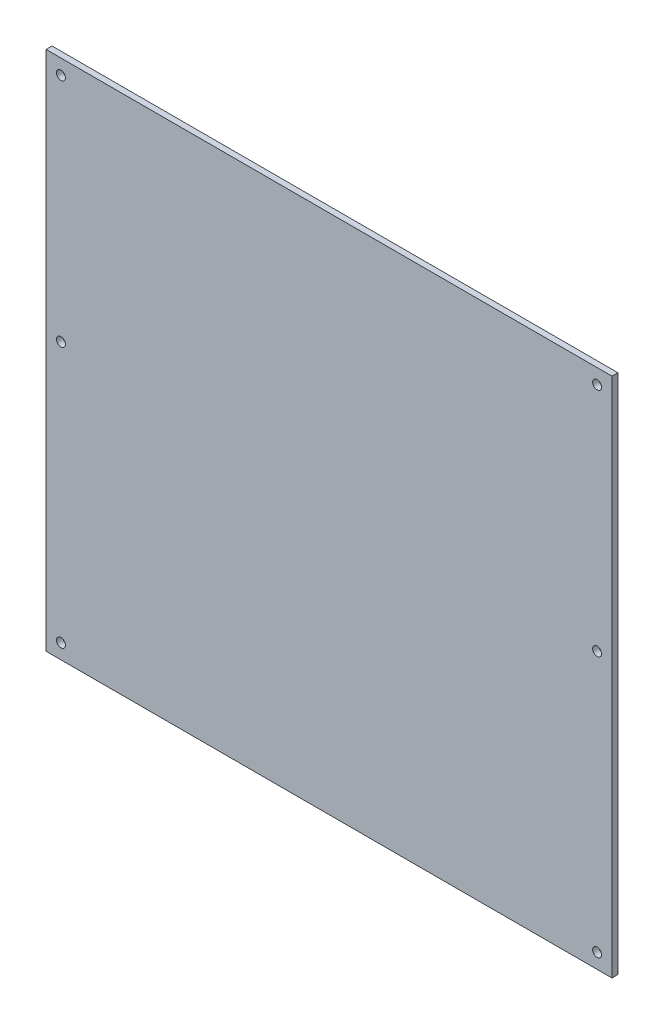
ISO-10303-21;
HEADER;
FILE_DESCRIPTION(('STEP AP214'),'2;1');
FILE_NAME('part.step','',(''),(''),'','','');
FILE_SCHEMA(('AUTOMOTIVE_DESIGN { 1 0 10303 214 1 1 1 1 }'));
ENDSEC;
DATA;
#1=APPLICATION_CONTEXT('core data for automotive mechanical design processes');
#2=APPLICATION_PROTOCOL_DEFINITION('international standard','automotive_design',2000,#1);
#3=PRODUCT_CONTEXT('',#1,'mechanical');
#4=PRODUCT('Part','Part','',(#3));
#5=PRODUCT_RELATED_PRODUCT_CATEGORY('part','',(#4));
#6=PRODUCT_DEFINITION_FORMATION('','',#4);
#7=PRODUCT_DEFINITION_CONTEXT('part definition',#1,'design');
#8=PRODUCT_DEFINITION('design','',#6,#7);
#9=PRODUCT_DEFINITION_SHAPE('','',#8);
#10=(LENGTH_UNIT() NAMED_UNIT(*) SI_UNIT(.MILLI.,.METRE.));
#11=(NAMED_UNIT(*) PLANE_ANGLE_UNIT() SI_UNIT($,.RADIAN.));
#12=(NAMED_UNIT(*) SI_UNIT($,.STERADIAN.) SOLID_ANGLE_UNIT());
#13=UNCERTAINTY_MEASURE_WITH_UNIT(LENGTH_MEASURE(1.E-05),#10,'distance_accuracy_value','');
#14=(GEOMETRIC_REPRESENTATION_CONTEXT(3) GLOBAL_UNCERTAINTY_ASSIGNED_CONTEXT((#13)) GLOBAL_UNIT_ASSIGNED_CONTEXT((#10,
#11,#12)) REPRESENTATION_CONTEXT('',''));
#15=CARTESIAN_POINT('',(0.,0.,0.));
#16=DIRECTION('',(0.,0.,1.));
#17=DIRECTION('',(1.,0.,0.));
#18=AXIS2_PLACEMENT_3D('',#15,#16,#17);
#19=CARTESIAN_POINT('',(0.,0.,4.));
#20=DIRECTION('',(0.,0.,1.));
#21=DIRECTION('',(1.,0.,0.));
#22=AXIS2_PLACEMENT_3D('',#19,#20,#21);
#23=PLANE('',#22);
#24=CARTESIAN_POINT('',(-180.,9.99999999999998,4.));
#25=DIRECTION('',(0.,0.,1.));
#26=DIRECTION('',(1.,0.,0.));
#27=AXIS2_PLACEMENT_3D('',#24,#25,#26);
#28=CIRCLE('',#27,2.99999999999999);
#29=CARTESIAN_POINT('',(-177.,9.99999999999998,4.));
#30=VERTEX_POINT('',#29);
#31=EDGE_CURVE('E133',#30,#30,#28,.T.);
#32=ORIENTED_EDGE('',*,*,#31,.F.);
#33=EDGE_LOOP('',(#32));
#34=FACE_BOUND('',#33,.T.);
#35=CARTESIAN_POINT('',(180.,9.99999999999998,4.));
#36=DIRECTION('',(0.,0.,1.));
#37=DIRECTION('',(1.,0.,0.));
#38=AXIS2_PLACEMENT_3D('',#35,#36,#37);
#39=CIRCLE('',#38,2.99999999999999);
#40=CARTESIAN_POINT('',(183.,9.99999999999998,4.));
#41=VERTEX_POINT('',#40);
#42=EDGE_CURVE('E121',#41,#41,#39,.T.);
#43=ORIENTED_EDGE('',*,*,#42,.F.);
#44=EDGE_LOOP('',(#43));
#45=FACE_BOUND('',#44,.T.);
#46=CARTESIAN_POINT('',(-180.,165.,4.));
#47=DIRECTION('',(0.,0.,1.));
#48=DIRECTION('',(1.,0.,0.));
#49=AXIS2_PLACEMENT_3D('',#46,#47,#48);
#50=CIRCLE('',#49,2.99999999999999);
#51=CARTESIAN_POINT('',(-177.,165.,4.));
#52=VERTEX_POINT('',#51);
#53=EDGE_CURVE('E100',#52,#52,#50,.T.);
#54=ORIENTED_EDGE('',*,*,#53,.F.);
#55=EDGE_LOOP('',(#54));
#56=FACE_BOUND('',#55,.T.);
#57=DIRECTION('',(0.,-1.,0.));
#58=VECTOR('',#57,1.);
#59=CARTESIAN_POINT('',(-190.,-175.,4.));
#60=LINE('',#59,#58);
#61=CARTESIAN_POINT('',(-190.,175.,4.));
#62=VERTEX_POINT('',#61);
#63=CARTESIAN_POINT('',(-190.,-175.,4.));
#64=VERTEX_POINT('',#63);
#65=EDGE_CURVE('E85',#62,#64,#60,.T.);
#66=ORIENTED_EDGE('',*,*,#65,.T.);
#67=DIRECTION('',(1.,0.,0.));
#68=VECTOR('',#67,1.);
#69=CARTESIAN_POINT('',(190.,-175.,4.));
#70=LINE('',#69,#68);
#71=CARTESIAN_POINT('',(190.,-175.,4.));
#72=VERTEX_POINT('',#71);
#73=EDGE_CURVE('E80',#64,#72,#70,.T.);
#74=ORIENTED_EDGE('',*,*,#73,.T.);
#75=DIRECTION('',(0.,1.,0.));
#76=VECTOR('',#75,1.);
#77=CARTESIAN_POINT('',(190.,-175.,4.));
#78=LINE('',#77,#76);
#79=CARTESIAN_POINT('',(190.,175.,4.));
#80=VERTEX_POINT('',#79);
#81=EDGE_CURVE('E83',#72,#80,#78,.T.);
#82=ORIENTED_EDGE('',*,*,#81,.T.);
#83=DIRECTION('',(-1.,0.,0.));
#84=VECTOR('',#83,1.);
#85=CARTESIAN_POINT('',(190.,175.,4.));
#86=LINE('',#85,#84);
#87=EDGE_CURVE('E50',#80,#62,#86,.T.);
#88=ORIENTED_EDGE('',*,*,#87,.T.);
#89=EDGE_LOOP('',(#66,#74,#82,#88));
#90=FACE_BOUND('',#89,.T.);
#91=CARTESIAN_POINT('',(180.,165.,4.));
#92=DIRECTION('',(0.,0.,1.));
#93=DIRECTION('',(1.,0.,0.));
#94=AXIS2_PLACEMENT_3D('',#91,#92,#93);
#95=CIRCLE('',#94,2.99999999999999);
#96=CARTESIAN_POINT('',(183.,165.,4.));
#97=VERTEX_POINT('',#96);
#98=EDGE_CURVE('E115',#97,#97,#95,.T.);
#99=ORIENTED_EDGE('',*,*,#98,.F.);
#100=EDGE_LOOP('',(#99));
#101=FACE_BOUND('',#100,.T.);
#102=CARTESIAN_POINT('',(180.,-165.,4.));
#103=DIRECTION('',(0.,0.,1.));
#104=DIRECTION('',(1.,0.,0.));
#105=AXIS2_PLACEMENT_3D('',#102,#103,#104);
#106=CIRCLE('',#105,2.99999999999999);
#107=CARTESIAN_POINT('',(183.,-165.,4.));
#108=VERTEX_POINT('',#107);
#109=EDGE_CURVE('E127',#108,#108,#106,.T.);
#110=ORIENTED_EDGE('',*,*,#109,.F.);
#111=EDGE_LOOP('',(#110));
#112=FACE_BOUND('',#111,.T.);
#113=CARTESIAN_POINT('',(-179.999999999997,-165.,4.));
#114=DIRECTION('',(0.,0.,1.));
#115=DIRECTION('',(1.,0.,0.));
#116=AXIS2_PLACEMENT_3D('',#113,#114,#115);
#117=CIRCLE('',#116,2.99999999999999);
#118=CARTESIAN_POINT('',(-176.999999999997,-165.,4.));
#119=VERTEX_POINT('',#118);
#120=EDGE_CURVE('E139',#119,#119,#117,.T.);
#121=ORIENTED_EDGE('',*,*,#120,.F.);
#122=EDGE_LOOP('',(#121));
#123=FACE_BOUND('',#122,.T.);
#124=ADVANCED_FACE('F33',(#34,#45,#56,#90,#101,#112,#123),#23,.T.);
#125=CARTESIAN_POINT('',(0.,0.,0.));
#126=DIRECTION('',(0.,0.,1.));
#127=DIRECTION('',(1.,0.,0.));
#128=AXIS2_PLACEMENT_3D('',#125,#126,#127);
#129=PLANE('',#128);
#130=DIRECTION('',(0.,-1.,0.));
#131=VECTOR('',#130,1.);
#132=CARTESIAN_POINT('',(-190.,-175.,0.));
#133=LINE('',#132,#131);
#134=CARTESIAN_POINT('',(-190.,175.,0.));
#135=VERTEX_POINT('',#134);
#136=CARTESIAN_POINT('',(-190.,-175.,0.));
#137=VERTEX_POINT('',#136);
#138=EDGE_CURVE('E97',#135,#137,#133,.T.);
#139=ORIENTED_EDGE('',*,*,#138,.F.);
#140=DIRECTION('',(-1.,0.,0.));
#141=VECTOR('',#140,1.);
#142=CARTESIAN_POINT('',(190.,175.,0.));
#143=LINE('',#142,#141);
#144=CARTESIAN_POINT('',(190.,175.,0.));
#145=VERTEX_POINT('',#144);
#146=EDGE_CURVE('E73',#145,#135,#143,.T.);
#147=ORIENTED_EDGE('',*,*,#146,.F.);
#148=DIRECTION('',(0.,1.,0.));
#149=VECTOR('',#148,1.);
#150=CARTESIAN_POINT('',(190.,-175.,0.));
#151=LINE('',#150,#149);
#152=CARTESIAN_POINT('',(190.,-175.,0.));
#153=VERTEX_POINT('',#152);
#154=EDGE_CURVE('E67',#153,#145,#151,.T.);
#155=ORIENTED_EDGE('',*,*,#154,.F.);
#156=DIRECTION('',(1.,0.,0.));
#157=VECTOR('',#156,1.);
#158=CARTESIAN_POINT('',(190.,-175.,0.));
#159=LINE('',#158,#157);
#160=EDGE_CURVE('E89',#137,#153,#159,.T.);
#161=ORIENTED_EDGE('',*,*,#160,.F.);
#162=EDGE_LOOP('',(#139,#147,#155,#161));
#163=FACE_BOUND('',#162,.T.);
#164=CARTESIAN_POINT('',(-180.,165.,0.));
#165=DIRECTION('',(0.,0.,1.));
#166=DIRECTION('',(1.,0.,0.));
#167=AXIS2_PLACEMENT_3D('',#164,#165,#166);
#168=CIRCLE('',#167,2.99999999999999);
#169=CARTESIAN_POINT('',(-177.,165.,0.));
#170=VERTEX_POINT('',#169);
#171=EDGE_CURVE('E112',#170,#170,#168,.T.);
#172=ORIENTED_EDGE('',*,*,#171,.T.);
#173=EDGE_LOOP('',(#172));
#174=FACE_BOUND('',#173,.T.);
#175=CARTESIAN_POINT('',(180.,165.,0.));
#176=DIRECTION('',(0.,0.,1.));
#177=DIRECTION('',(1.,0.,0.));
#178=AXIS2_PLACEMENT_3D('',#175,#176,#177);
#179=CIRCLE('',#178,2.99999999999999);
#180=CARTESIAN_POINT('',(183.,165.,0.));
#181=VERTEX_POINT('',#180);
#182=EDGE_CURVE('E118',#181,#181,#179,.T.);
#183=ORIENTED_EDGE('',*,*,#182,.T.);
#184=EDGE_LOOP('',(#183));
#185=FACE_BOUND('',#184,.T.);
#186=CARTESIAN_POINT('',(180.,9.99999999999998,0.));
#187=DIRECTION('',(0.,0.,1.));
#188=DIRECTION('',(1.,0.,0.));
#189=AXIS2_PLACEMENT_3D('',#186,#187,#188);
#190=CIRCLE('',#189,2.99999999999999);
#191=CARTESIAN_POINT('',(183.,9.99999999999998,0.));
#192=VERTEX_POINT('',#191);
#193=EDGE_CURVE('E124',#192,#192,#190,.T.);
#194=ORIENTED_EDGE('',*,*,#193,.T.);
#195=EDGE_LOOP('',(#194));
#196=FACE_BOUND('',#195,.T.);
#197=CARTESIAN_POINT('',(180.,-165.,0.));
#198=DIRECTION('',(0.,0.,1.));
#199=DIRECTION('',(1.,0.,0.));
#200=AXIS2_PLACEMENT_3D('',#197,#198,#199);
#201=CIRCLE('',#200,2.99999999999999);
#202=CARTESIAN_POINT('',(183.,-165.,0.));
#203=VERTEX_POINT('',#202);
#204=EDGE_CURVE('E130',#203,#203,#201,.T.);
#205=ORIENTED_EDGE('',*,*,#204,.T.);
#206=EDGE_LOOP('',(#205));
#207=FACE_BOUND('',#206,.T.);
#208=CARTESIAN_POINT('',(-180.,9.99999999999998,0.));
#209=DIRECTION('',(0.,0.,1.));
#210=DIRECTION('',(1.,0.,0.));
#211=AXIS2_PLACEMENT_3D('',#208,#209,#210);
#212=CIRCLE('',#211,2.99999999999999);
#213=CARTESIAN_POINT('',(-177.,9.99999999999998,0.));
#214=VERTEX_POINT('',#213);
#215=EDGE_CURVE('E136',#214,#214,#212,.T.);
#216=ORIENTED_EDGE('',*,*,#215,.T.);
#217=EDGE_LOOP('',(#216));
#218=FACE_BOUND('',#217,.T.);
#219=CARTESIAN_POINT('',(-179.999999999997,-165.,0.));
#220=DIRECTION('',(0.,0.,1.));
#221=DIRECTION('',(1.,0.,0.));
#222=AXIS2_PLACEMENT_3D('',#219,#220,#221);
#223=CIRCLE('',#222,2.99999999999999);
#224=CARTESIAN_POINT('',(-176.999999999997,-165.,0.));
#225=VERTEX_POINT('',#224);
#226=EDGE_CURVE('E142',#225,#225,#223,.T.);
#227=ORIENTED_EDGE('',*,*,#226,.T.);
#228=EDGE_LOOP('',(#227));
#229=FACE_BOUND('',#228,.T.);
#230=ADVANCED_FACE('F108',(#163,#174,#185,#196,#207,#218,#229),#129,.F.);
#231=CARTESIAN_POINT('',(-190.,-175.,4.));
#232=DIRECTION('',(1.,0.,0.));
#233=DIRECTION('',(0.,0.,-1.));
#234=AXIS2_PLACEMENT_3D('',#231,#232,#233);
#235=PLANE('',#234);
#236=ORIENTED_EDGE('',*,*,#138,.T.);
#237=DIRECTION('',(0.,0.,-1.));
#238=VECTOR('',#237,1.);
#239=CARTESIAN_POINT('',(-190.,-175.,4.));
#240=LINE('',#239,#238);
#241=EDGE_CURVE('E11',#64,#137,#240,.T.);
#242=ORIENTED_EDGE('',*,*,#241,.F.);
#243=ORIENTED_EDGE('',*,*,#65,.F.);
#244=DIRECTION('',(0.,0.,-1.));
#245=VECTOR('',#244,1.);
#246=CARTESIAN_POINT('',(-190.,175.,4.));
#247=LINE('',#246,#245);
#248=EDGE_CURVE('E93',#62,#135,#247,.T.);
#249=ORIENTED_EDGE('',*,*,#248,.T.);
#250=EDGE_LOOP('',(#236,#242,#243,#249));
#251=FACE_BOUND('',#250,.T.);
#252=ADVANCED_FACE('F35',(#251),#235,.F.);
#253=CARTESIAN_POINT('',(190.,-175.,4.));
#254=DIRECTION('',(0.,1.,0.));
#255=DIRECTION('',(-1.,0.,0.));
#256=AXIS2_PLACEMENT_3D('',#253,#254,#255);
#257=PLANE('',#256);
#258=ORIENTED_EDGE('',*,*,#160,.T.);
#259=DIRECTION('',(0.,0.,-1.));
#260=VECTOR('',#259,1.);
#261=CARTESIAN_POINT('',(190.,-175.,4.));
#262=LINE('',#261,#260);
#263=EDGE_CURVE('E42',#72,#153,#262,.T.);
#264=ORIENTED_EDGE('',*,*,#263,.F.);
#265=ORIENTED_EDGE('',*,*,#73,.F.);
#266=ORIENTED_EDGE('',*,*,#241,.T.);
#267=EDGE_LOOP('',(#258,#264,#265,#266));
#268=FACE_BOUND('',#267,.T.);
#269=ADVANCED_FACE('F88',(#268),#257,.F.);
#270=CARTESIAN_POINT('',(190.,-175.,4.));
#271=DIRECTION('',(-1.,0.,0.));
#272=DIRECTION('',(0.,0.,1.));
#273=AXIS2_PLACEMENT_3D('',#270,#271,#272);
#274=PLANE('',#273);
#275=ORIENTED_EDGE('',*,*,#154,.T.);
#276=DIRECTION('',(0.,0.,-1.));
#277=VECTOR('',#276,1.);
#278=CARTESIAN_POINT('',(190.,175.,4.));
#279=LINE('',#278,#277);
#280=EDGE_CURVE('E90',#80,#145,#279,.T.);
#281=ORIENTED_EDGE('',*,*,#280,.F.);
#282=ORIENTED_EDGE('',*,*,#81,.F.);
#283=ORIENTED_EDGE('',*,*,#263,.T.);
#284=EDGE_LOOP('',(#275,#281,#282,#283));
#285=FACE_BOUND('',#284,.T.);
#286=ADVANCED_FACE('F91',(#285),#274,.F.);
#287=CARTESIAN_POINT('',(190.,175.,4.));
#288=DIRECTION('',(0.,-1.,0.));
#289=DIRECTION('',(1.,0.,0.));
#290=AXIS2_PLACEMENT_3D('',#287,#288,#289);
#291=PLANE('',#290);
#292=ORIENTED_EDGE('',*,*,#146,.T.);
#293=ORIENTED_EDGE('',*,*,#248,.F.);
#294=ORIENTED_EDGE('',*,*,#87,.F.);
#295=ORIENTED_EDGE('',*,*,#280,.T.);
#296=EDGE_LOOP('',(#292,#293,#294,#295));
#297=FACE_BOUND('',#296,.T.);
#298=ADVANCED_FACE('F105',(#297),#291,.F.);
#299=CARTESIAN_POINT('',(-180.,165.,4.));
#300=DIRECTION('',(0.,0.,-1.));
#301=DIRECTION('',(-1.,0.,0.));
#302=AXIS2_PLACEMENT_3D('',#299,#300,#301);
#303=CYLINDRICAL_SURFACE('',#302,2.99999999999999);
#304=ORIENTED_EDGE('',*,*,#53,.T.);
#305=EDGE_LOOP('',(#304));
#306=FACE_BOUND('',#305,.T.);
#307=ORIENTED_EDGE('',*,*,#171,.F.);
#308=EDGE_LOOP('',(#307));
#309=FACE_BOUND('',#308,.T.);
#310=ADVANCED_FACE('F161',(#306,#309),#303,.F.);
#311=CARTESIAN_POINT('',(180.,165.,4.));
#312=DIRECTION('',(0.,0.,-1.));
#313=DIRECTION('',(-1.,0.,0.));
#314=AXIS2_PLACEMENT_3D('',#311,#312,#313);
#315=CYLINDRICAL_SURFACE('',#314,2.99999999999999);
#316=ORIENTED_EDGE('',*,*,#98,.T.);
#317=EDGE_LOOP('',(#316));
#318=FACE_BOUND('',#317,.T.);
#319=ORIENTED_EDGE('',*,*,#182,.F.);
#320=EDGE_LOOP('',(#319));
#321=FACE_BOUND('',#320,.T.);
#322=ADVANCED_FACE('F207',(#318,#321),#315,.F.);
#323=CARTESIAN_POINT('',(180.,9.99999999999998,4.));
#324=DIRECTION('',(0.,0.,-1.));
#325=DIRECTION('',(-1.,0.,0.));
#326=AXIS2_PLACEMENT_3D('',#323,#324,#325);
#327=CYLINDRICAL_SURFACE('',#326,2.99999999999999);
#328=ORIENTED_EDGE('',*,*,#42,.T.);
#329=EDGE_LOOP('',(#328));
#330=FACE_BOUND('',#329,.T.);
#331=ORIENTED_EDGE('',*,*,#193,.F.);
#332=EDGE_LOOP('',(#331));
#333=FACE_BOUND('',#332,.T.);
#334=ADVANCED_FACE('F215',(#330,#333),#327,.F.);
#335=CARTESIAN_POINT('',(180.,-165.,4.));
#336=DIRECTION('',(0.,0.,-1.));
#337=DIRECTION('',(-1.,0.,0.));
#338=AXIS2_PLACEMENT_3D('',#335,#336,#337);
#339=CYLINDRICAL_SURFACE('',#338,2.99999999999999);
#340=ORIENTED_EDGE('',*,*,#109,.T.);
#341=EDGE_LOOP('',(#340));
#342=FACE_BOUND('',#341,.T.);
#343=ORIENTED_EDGE('',*,*,#204,.F.);
#344=EDGE_LOOP('',(#343));
#345=FACE_BOUND('',#344,.T.);
#346=ADVANCED_FACE('F223',(#342,#345),#339,.F.);
#347=CARTESIAN_POINT('',(-180.,9.99999999999998,4.));
#348=DIRECTION('',(0.,0.,-1.));
#349=DIRECTION('',(-1.,0.,0.));
#350=AXIS2_PLACEMENT_3D('',#347,#348,#349);
#351=CYLINDRICAL_SURFACE('',#350,2.99999999999999);
#352=ORIENTED_EDGE('',*,*,#31,.T.);
#353=EDGE_LOOP('',(#352));
#354=FACE_BOUND('',#353,.T.);
#355=ORIENTED_EDGE('',*,*,#215,.F.);
#356=EDGE_LOOP('',(#355));
#357=FACE_BOUND('',#356,.T.);
#358=ADVANCED_FACE('F232',(#354,#357),#351,.F.);
#359=CARTESIAN_POINT('',(-179.999999999997,-165.,4.));
#360=DIRECTION('',(0.,0.,-1.));
#361=DIRECTION('',(-1.,0.,0.));
#362=AXIS2_PLACEMENT_3D('',#359,#360,#361);
#363=CYLINDRICAL_SURFACE('',#362,2.99999999999999);
#364=ORIENTED_EDGE('',*,*,#120,.T.);
#365=EDGE_LOOP('',(#364));
#366=FACE_BOUND('',#365,.T.);
#367=ORIENTED_EDGE('',*,*,#226,.F.);
#368=EDGE_LOOP('',(#367));
#369=FACE_BOUND('',#368,.T.);
#370=ADVANCED_FACE('F148',(#366,#369),#363,.F.);
#371=CLOSED_SHELL('',(#124,#230,#252,#269,#286,#298,#310,#322,#334,#346,#358,#370));
#372=MANIFOLD_SOLID_BREP('B2',#371);
#373=ADVANCED_BREP_SHAPE_REPRESENTATION('',(#18,#372),#14);
#374=SHAPE_DEFINITION_REPRESENTATION(#9,#373);
ENDSEC;
END-ISO-10303-21;
